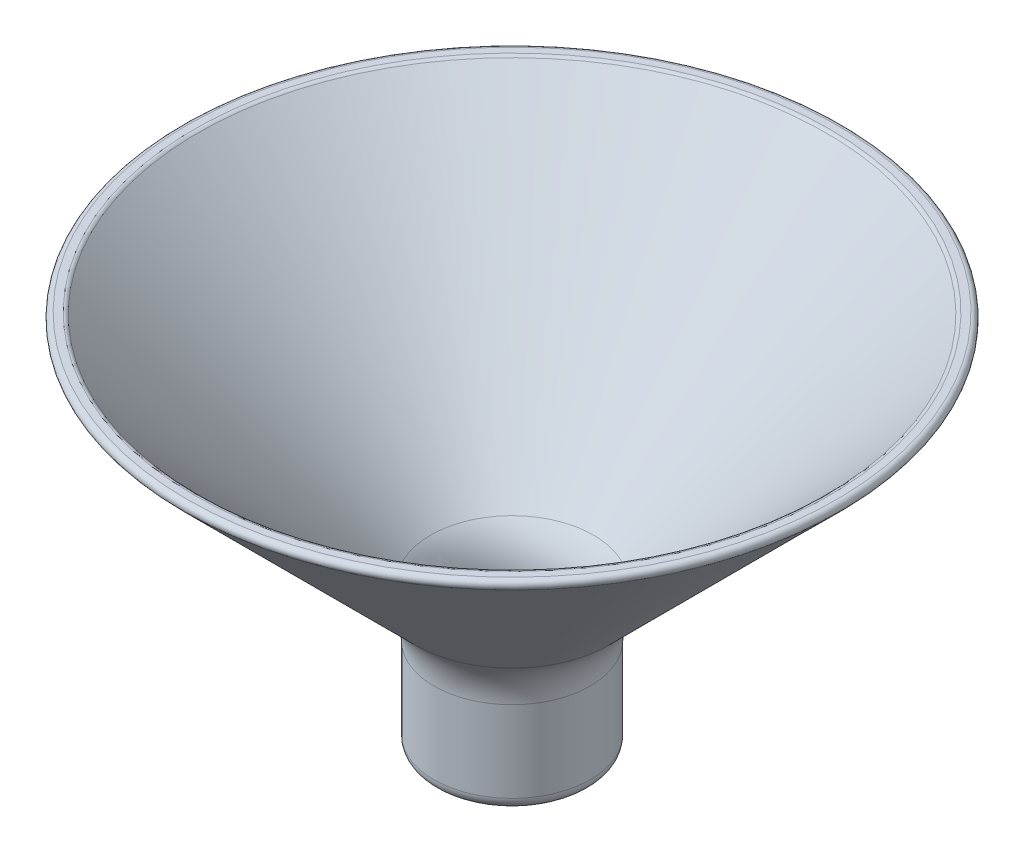
ISO-10303-21;
HEADER;
FILE_DESCRIPTION(('STEP AP214'),'2;1');
FILE_NAME('part.step','',(''),(''),'','','');
FILE_SCHEMA(('AUTOMOTIVE_DESIGN { 1 0 10303 214 1 1 1 1 }'));
ENDSEC;
DATA;
#1=APPLICATION_CONTEXT('core data for automotive mechanical design processes');
#2=APPLICATION_PROTOCOL_DEFINITION('international standard','automotive_design',2000,#1);
#3=PRODUCT_CONTEXT('',#1,'mechanical');
#4=PRODUCT('Part','Part','',(#3));
#5=PRODUCT_RELATED_PRODUCT_CATEGORY('part','',(#4));
#6=PRODUCT_DEFINITION_FORMATION('','',#4);
#7=PRODUCT_DEFINITION_CONTEXT('part definition',#1,'design');
#8=PRODUCT_DEFINITION('design','',#6,#7);
#9=PRODUCT_DEFINITION_SHAPE('','',#8);
#10=(LENGTH_UNIT() NAMED_UNIT(*) SI_UNIT(.MILLI.,.METRE.));
#11=(NAMED_UNIT(*) PLANE_ANGLE_UNIT() SI_UNIT($,.RADIAN.));
#12=(NAMED_UNIT(*) SI_UNIT($,.STERADIAN.) SOLID_ANGLE_UNIT());
#13=UNCERTAINTY_MEASURE_WITH_UNIT(LENGTH_MEASURE(1.E-05),#10,'distance_accuracy_value','');
#14=(GEOMETRIC_REPRESENTATION_CONTEXT(3) GLOBAL_UNCERTAINTY_ASSIGNED_CONTEXT((#13)) GLOBAL_UNIT_ASSIGNED_CONTEXT((#10,
#11,#12)) REPRESENTATION_CONTEXT('',''));
#15=CARTESIAN_POINT('',(0.,0.,0.));
#16=DIRECTION('',(0.,0.,1.));
#17=DIRECTION('',(1.,0.,0.));
#18=AXIS2_PLACEMENT_3D('',#15,#16,#17);
#19=CARTESIAN_POINT('',(2.,0.,0.));
#20=DIRECTION('',(0.,-1.,0.));
#21=DIRECTION('',(0.,0.,-1.));
#22=AXIS2_PLACEMENT_3D('',#19,#20,#21);
#23=PLANE('',#22);
#24=CARTESIAN_POINT('',(0.,0.,0.));
#25=DIRECTION('',(0.,-1.,0.));
#26=DIRECTION('',(0.,0.,-1.));
#27=AXIS2_PLACEMENT_3D('',#24,#25,#26);
#28=CIRCLE('',#27,5.2);
#29=CARTESIAN_POINT('',(0.,0.,-5.2));
#30=VERTEX_POINT('',#29);
#31=EDGE_CURVE('E38',#30,#30,#28,.T.);
#32=ORIENTED_EDGE('',*,*,#31,.T.);
#33=EDGE_LOOP('',(#32));
#34=FACE_BOUND('',#33,.T.);
#35=CARTESIAN_POINT('',(0.,0.,0.));
#36=DIRECTION('',(0.,-1.,0.));
#37=DIRECTION('',(0.,0.,-1.));
#38=AXIS2_PLACEMENT_3D('',#35,#36,#37);
#39=CIRCLE('',#38,2.);
#40=CARTESIAN_POINT('',(0.,0.,-2.));
#41=VERTEX_POINT('',#40);
#42=EDGE_CURVE('E69',#41,#41,#39,.T.);
#43=ORIENTED_EDGE('',*,*,#42,.F.);
#44=EDGE_LOOP('',(#43));
#45=FACE_BOUND('',#44,.T.);
#46=ADVANCED_FACE('F31',(#34,#45),#23,.T.);
#47=CARTESIAN_POINT('',(0.,5.19615242270666,0.));
#48=DIRECTION('',(0.,1.,0.));
#49=DIRECTION('',(0.,0.,1.));
#50=AXIS2_PLACEMENT_3D('',#47,#48,#49);
#51=CONICAL_SURFACE('',#50,5.,0.523598775598296);
#52=ORIENTED_EDGE('',*,*,#42,.T.);
#53=EDGE_LOOP('',(#52));
#54=FACE_BOUND('',#53,.T.);
#55=CARTESIAN_POINT('',(0.,5.19615242270666,0.));
#56=DIRECTION('',(0.,-1.,0.));
#57=DIRECTION('',(0.,0.,-1.));
#58=AXIS2_PLACEMENT_3D('',#55,#56,#57);
#59=CIRCLE('',#58,5.);
#60=CARTESIAN_POINT('',(0.,5.19615242270666,-5.));
#61=VERTEX_POINT('',#60);
#62=EDGE_CURVE('E72',#61,#61,#59,.T.);
#63=ORIENTED_EDGE('',*,*,#62,.F.);
#64=EDGE_LOOP('',(#63));
#65=FACE_BOUND('',#64,.T.);
#66=ADVANCED_FACE('F78',(#54,#65),#51,.F.);
#67=CARTESIAN_POINT('',(0.,0.,0.));
#68=DIRECTION('',(0.,-1.,0.));
#69=DIRECTION('',(0.,0.,-1.));
#70=AXIS2_PLACEMENT_3D('',#67,#68,#69);
#71=CYLINDRICAL_SURFACE('',#70,5.);
#72=CARTESIAN_POINT('',(0.,7.92893218813452,0.));
#73=DIRECTION('',(0.,1.,0.));
#74=DIRECTION('',(0.,0.,1.));
#75=AXIS2_PLACEMENT_3D('',#72,#73,#74);
#76=CIRCLE('',#75,5.);
#77=CARTESIAN_POINT('',(0.,7.92893218813452,5.));
#78=VERTEX_POINT('',#77);
#79=EDGE_CURVE('E63',#78,#78,#76,.T.);
#80=ORIENTED_EDGE('',*,*,#79,.T.);
#81=EDGE_LOOP('',(#80));
#82=FACE_BOUND('',#81,.T.);
#83=ORIENTED_EDGE('',*,*,#62,.T.);
#84=EDGE_LOOP('',(#83));
#85=FACE_BOUND('',#84,.T.);
#86=ADVANCED_FACE('F76',(#82,#85),#71,.F.);
#87=CARTESIAN_POINT('',(0.,30.,0.));
#88=DIRECTION('',(0.,1.,0.));
#89=DIRECTION('',(0.,0.,1.));
#90=AXIS2_PLACEMENT_3D('',#87,#88,#89);
#91=CONICAL_SURFACE('',#90,25.0000000000001,0.78539816339745);
#92=CARTESIAN_POINT('',(0.,29.8828427124746,0.));
#93=DIRECTION('',(0.,-1.,0.));
#94=DIRECTION('',(0.,0.,-1.));
#95=AXIS2_PLACEMENT_3D('',#92,#93,#94);
#96=CIRCLE('',#95,24.8828427124747);
#97=CARTESIAN_POINT('',(0.,29.8828427124746,24.8828427124747));
#98=VERTEX_POINT('',#97);
#99=EDGE_CURVE('E42',#98,#98,#96,.F.);
#100=CARTESIAN_POINT('',(0.,11.4644660940673,0.));
#101=DIRECTION('',(0.,-1.,0.));
#102=DIRECTION('',(0.,0.,-1.));
#103=AXIS2_PLACEMENT_3D('',#100,#101,#102);
#104=CIRCLE('',#103,6.46446609406727);
#105=CARTESIAN_POINT('',(0.,11.4644660940673,6.46446609406726));
#106=VERTEX_POINT('',#105);
#107=EDGE_CURVE('E66',#106,#106,#104,.T.);
#108=CARTESIAN_POINT('',(0.,29.8828427124746,24.8828427124747));
#109=CARTESIAN_POINT('',(0.,29.6909846226995,24.6909846226996));
#110=CARTESIAN_POINT('',(0.,29.4991265329245,24.4991265329245));
#111=CARTESIAN_POINT('',(0.,29.1154103533743,24.1154103533744));
#112=CARTESIAN_POINT('',(0.,28.9235522635992,23.9235522635993));
#113=CARTESIAN_POINT('',(0.,28.5398360840491,23.5398360840491));
#114=CARTESIAN_POINT('',(0.,28.347977994274,23.3479779942741));
#115=CARTESIAN_POINT('',(0.,27.9642618147239,22.9642618147239));
#116=CARTESIAN_POINT('',(0.,27.7724037249488,22.7724037249488));
#117=CARTESIAN_POINT('',(0.,27.3886875453986,22.3886875453987));
#118=CARTESIAN_POINT('',(0.,27.1968294556235,22.1968294556236));
#119=CARTESIAN_POINT('',(0.,26.8131132760734,21.8131132760734));
#120=CARTESIAN_POINT('',(0.,26.6212551862983,21.6212551862984));
#121=CARTESIAN_POINT('',(0.,26.2375390067482,21.2375390067482));
#122=CARTESIAN_POINT('',(0.,26.0456809169731,21.0456809169731));
#123=CARTESIAN_POINT('',(0.,25.6619647374229,20.661964737423));
#124=CARTESIAN_POINT('',(0.,25.4701066476479,20.4701066476479));
#125=CARTESIAN_POINT('',(0.,25.0863904680977,20.0863904680977));
#126=CARTESIAN_POINT('',(0.,24.8945323783226,19.8945323783227));
#127=CARTESIAN_POINT('',(0.,24.5108161987725,19.5108161987725));
#128=CARTESIAN_POINT('',(0.,24.3189581089974,19.3189581089974));
#129=CARTESIAN_POINT('',(0.,23.9352419294472,18.9352419294473));
#130=CARTESIAN_POINT('',(0.,23.7433838396722,18.7433838396722));
#131=CARTESIAN_POINT('',(0.,23.359667660122,18.3596676601221));
#132=CARTESIAN_POINT('',(0.,23.1678095703469,18.167809570347));
#133=CARTESIAN_POINT('',(0.,22.7840933907968,17.7840933907968));
#134=CARTESIAN_POINT('',(0.,22.5922353010217,17.5922353010217));
#135=CARTESIAN_POINT('',(0.,22.2085191214716,17.2085191214716));
#136=CARTESIAN_POINT('',(0.,22.0166610316965,17.0166610316965));
#137=CARTESIAN_POINT('',(0.,21.6329448521463,16.6329448521464));
#138=CARTESIAN_POINT('',(0.,21.4410867623712,16.4410867623713));
#139=CARTESIAN_POINT('',(0.,21.0573705828211,16.0573705828211));
#140=CARTESIAN_POINT('',(0.,20.865512493046,15.865512493046));
#141=CARTESIAN_POINT('',(0.,20.4817963134959,15.4817963134959));
#142=CARTESIAN_POINT('',(0.,20.2899382237208,15.2899382237208));
#143=CARTESIAN_POINT('',(0.,19.9062220441706,14.9062220441707));
#144=CARTESIAN_POINT('',(0.,19.7143639543956,14.7143639543956));
#145=CARTESIAN_POINT('',(0.,19.3306477748454,14.3306477748454));
#146=CARTESIAN_POINT('',(0.,19.1387896850703,14.1387896850704));
#147=CARTESIAN_POINT('',(0.,18.7550735055202,13.7550735055202));
#148=CARTESIAN_POINT('',(0.,18.5632154157451,13.5632154157451));
#149=CARTESIAN_POINT('',(0.,18.1794992361949,13.179499236195));
#150=CARTESIAN_POINT('',(0.,17.9876411464199,12.9876411464199));
#151=CARTESIAN_POINT('',(0.,17.6039249668697,12.6039249668697));
#152=CARTESIAN_POINT('',(0.,17.4120668770946,12.4120668770947));
#153=CARTESIAN_POINT('',(0.,17.0283506975445,12.0283506975445));
#154=CARTESIAN_POINT('',(0.,16.8364926077694,11.8364926077694));
#155=CARTESIAN_POINT('',(0.,16.4527764282193,11.4527764282193));
#156=CARTESIAN_POINT('',(0.,16.2609183384442,11.2609183384442));
#157=CARTESIAN_POINT('',(0.,15.877202158894,10.877202158894));
#158=CARTESIAN_POINT('',(0.,15.6853440691189,10.685344069119));
#159=CARTESIAN_POINT('',(0.,15.3016278895688,10.3016278895688));
#160=CARTESIAN_POINT('',(0.,15.1097697997937,10.1097697997937));
#161=CARTESIAN_POINT('',(0.,14.7260536202436,9.72605362024358));
#162=CARTESIAN_POINT('',(0.,14.5341955304685,9.5341955304685));
#163=CARTESIAN_POINT('',(0.,14.1504793509183,9.15047935091834));
#164=CARTESIAN_POINT('',(0.,13.9586212611433,8.95862126114326));
#165=CARTESIAN_POINT('',(0.,13.5749050815931,8.57490508159311));
#166=CARTESIAN_POINT('',(0.,13.383046991818,8.38304699181804));
#167=CARTESIAN_POINT('',(0.,12.9993308122679,7.99933081226789));
#168=CARTESIAN_POINT('',(0.,12.8074727224928,7.80747272249281));
#169=CARTESIAN_POINT('',(0.,12.4237565429426,7.42375654294265));
#170=CARTESIAN_POINT('',(0.,12.2318984531676,7.23189845316757));
#171=CARTESIAN_POINT('',(0.,11.8481822736174,6.84818227361742));
#172=CARTESIAN_POINT('',(0.,11.6563241838423,6.65632418384234));
#173=CARTESIAN_POINT('',(0.,11.4644660940673,6.46446609406726));
#174=B_SPLINE_CURVE_WITH_KNOTS('',3,(#108,#109,#110,#111,#112,#113,#114,#115,#116,#117,#118,
#119,#120,#121,#122,#123,#124,#125,#126,#127,#128,#129,#130,#131,#132,#133,#134,#135,#136,#137,
#138,#139,#140,#141,#142,#143,#144,#145,#146,#147,#148,#149,#150,#151,#152,#153,#154,#155,#156,
#157,#158,#159,#160,#161,#162,#163,#164,#165,#166,#167,#168,#169,#170,#171,#172,#173),
.UNSPECIFIED.,.F.,.F.,(4,2,2,2,2,2,2,2,2,2,2,2,2,2,2,2,2,2,2,2,2,2,2,2,2,2,2,2,2,2,2,2,4),(0.,
0.813984937832724,1.62796987566545,2.44195481349817,3.2559397513309,4.06992468916363,
4.88390962699635,5.69789456482908,6.5118795026618,7.32586444049453,8.13984937832726,
8.95383431615998,9.76781925399271,10.5818041918254,11.3957891296582,12.2097740674909,
13.0237590053236,13.8377439431563,14.6517288809891,15.4657138188218,16.2796987566545,
17.0936836944872,17.90766863232,18.7216535701527,19.5356385079854,20.3496234458181,
21.1636083836509,21.9775933214836,22.7915782593163,23.605563197149,24.4195481349818,
25.2335330728145,26.0475180106472),.UNSPECIFIED.);
#175=EDGE_CURVE('BSEAM86',#98,#106,#174,.T.);
#176=ORIENTED_EDGE('',*,*,#99,.T.);
#177=ORIENTED_EDGE('',*,*,#107,.T.);
#178=ORIENTED_EDGE('',*,*,#175,.T.);
#179=ORIENTED_EDGE('',*,*,#175,.F.);
#180=EDGE_LOOP('',(#176,#178,#177,#179));
#181=FACE_BOUND('',#180,.T.);
#182=ADVANCED_FACE('F86',(#181),#91,.F.);
#183=CARTESIAN_POINT('',(25.0000000000001,30.,0.));
#184=DIRECTION('',(0.,1.,0.));
#185=DIRECTION('',(0.,0.,1.));
#186=AXIS2_PLACEMENT_3D('',#183,#184,#185);
#187=PLANE('',#186);
#188=CARTESIAN_POINT('',(0.,30.,0.));
#189=DIRECTION('',(0.,1.,0.));
#190=DIRECTION('',(0.,0.,1.));
#191=AXIS2_PLACEMENT_3D('',#188,#189,#190);
#192=CIRCLE('',#191,25.7313708498985);
#193=CARTESIAN_POINT('',(0.,30.,25.7313708498985));
#194=VERTEX_POINT('',#193);
#195=EDGE_CURVE('E46',#194,#194,#192,.T.);
#196=ORIENTED_EDGE('',*,*,#195,.T.);
#197=EDGE_LOOP('',(#196));
#198=FACE_BOUND('',#197,.T.);
#199=CARTESIAN_POINT('',(0.,30.,0.));
#200=DIRECTION('',(0.,1.,0.));
#201=DIRECTION('',(0.,0.,1.));
#202=AXIS2_PLACEMENT_3D('',#199,#200,#201);
#203=CIRCLE('',#202,25.1656854249493);
#204=CARTESIAN_POINT('',(0.,30.,25.1656854249493));
#205=VERTEX_POINT('',#204);
#206=EDGE_CURVE('E51',#205,#205,#203,.F.);
#207=ORIENTED_EDGE('',*,*,#206,.T.);
#208=EDGE_LOOP('',(#207));
#209=FACE_BOUND('',#208,.T.);
#210=ADVANCED_FACE('F116',(#198,#209),#187,.T.);
#211=CARTESIAN_POINT('',(0.,9.50294372515229,0.));
#212=DIRECTION('',(0.,1.,0.));
#213=DIRECTION('',(0.,0.,1.));
#214=AXIS2_PLACEMENT_3D('',#211,#212,#213);
#215=CONICAL_SURFACE('',#214,6.2,0.78539816339745);
#216=CARTESIAN_POINT('',(0.,29.3171572875254,0.));
#217=DIRECTION('',(0.,-1.,0.));
#218=DIRECTION('',(0.,0.,-1.));
#219=AXIS2_PLACEMENT_3D('',#216,#217,#218);
#220=CIRCLE('',#219,26.0142135623732);
#221=CARTESIAN_POINT('',(0.,29.3171572875254,26.0142135623732));
#222=VERTEX_POINT('',#221);
#223=EDGE_CURVE('E54',#222,#222,#220,.T.);
#224=CARTESIAN_POINT('',(0.,10.9674098192195,0.));
#225=DIRECTION('',(0.,1.,0.));
#226=DIRECTION('',(0.,0.,1.));
#227=AXIS2_PLACEMENT_3D('',#224,#225,#226);
#228=CIRCLE('',#227,7.66446609406727);
#229=CARTESIAN_POINT('',(0.,10.9674098192195,7.66446609406727));
#230=VERTEX_POINT('',#229);
#231=EDGE_CURVE('E57',#230,#230,#228,.T.);
#232=CARTESIAN_POINT('',(0.,29.3171572875254,26.0142135623732));
#233=CARTESIAN_POINT('',(0.,29.1260140847305,25.8230703595783));
#234=CARTESIAN_POINT('',(0.,28.9348708819357,25.6319271567835));
#235=CARTESIAN_POINT('',(0.,28.552584476346,25.2496407511938));
#236=CARTESIAN_POINT('',(0.,28.3614412735511,25.0584975483989));
#237=CARTESIAN_POINT('',(0.,27.9791548679614,24.6762111428092));
#238=CARTESIAN_POINT('',(0.,27.7880116651666,24.4850679400143));
#239=CARTESIAN_POINT('',(0.,27.4057252595769,24.1027815344246));
#240=CARTESIAN_POINT('',(0.,27.214582056782,23.9116383316298));
#241=CARTESIAN_POINT('',(0.,26.8322956511923,23.5293519260401));
#242=CARTESIAN_POINT('',(0.,26.6411524483974,23.3382087232452));
#243=CARTESIAN_POINT('',(0.,26.2588660428077,22.9559223176555));
#244=CARTESIAN_POINT('',(0.,26.0677228400129,22.7647791148607));
#245=CARTESIAN_POINT('',(0.,25.6854364344232,22.382492709271));
#246=CARTESIAN_POINT('',(0.,25.4942932316283,22.1913495064761));
#247=CARTESIAN_POINT('',(0.,25.1120068260386,21.8090631008864));
#248=CARTESIAN_POINT('',(0.,24.9208636232438,21.6179198980915));
#249=CARTESIAN_POINT('',(0.,24.5385772176541,21.2356334925018));
#250=CARTESIAN_POINT('',(0.,24.3474340148592,21.044490289707));
#251=CARTESIAN_POINT('',(0.,23.9651476092695,20.6622038841173));
#252=CARTESIAN_POINT('',(0.,23.7740044064747,20.4710606813224));
#253=CARTESIAN_POINT('',(0.,23.391718000885,20.0887742757327));
#254=CARTESIAN_POINT('',(0.,23.2005747980901,19.8976310729379));
#255=CARTESIAN_POINT('',(0.,22.8182883925004,19.5153446673482));
#256=CARTESIAN_POINT('',(0.,22.6271451897055,19.3242014645533));
#257=CARTESIAN_POINT('',(0.,22.2448587841158,18.9419150589636));
#258=CARTESIAN_POINT('',(0.,22.053715581321,18.7507718561687));
#259=CARTESIAN_POINT('',(0.,21.6714291757313,18.368485450579));
#260=CARTESIAN_POINT('',(0.,21.4802859729364,18.1773422477842));
#261=CARTESIAN_POINT('',(0.,21.0979995673467,17.7950558421945));
#262=CARTESIAN_POINT('',(0.,20.9068563645519,17.6039126393996));
#263=CARTESIAN_POINT('',(0.,20.5245699589622,17.2216262338099));
#264=CARTESIAN_POINT('',(0.,20.3334267561673,17.0304830310151));
#265=CARTESIAN_POINT('',(0.,19.9511403505776,16.6481966254254));
#266=CARTESIAN_POINT('',(0.,19.7599971477828,16.4570534226305));
#267=CARTESIAN_POINT('',(0.,19.3777107421931,16.0747670170408));
#268=CARTESIAN_POINT('',(0.,19.1865675393982,15.883623814246));
#269=CARTESIAN_POINT('',(0.,18.8042811338085,15.5013374086562));
#270=CARTESIAN_POINT('',(0.,18.6131379310136,15.3101942058614));
#271=CARTESIAN_POINT('',(0.,18.2308515254239,14.9279078002717));
#272=CARTESIAN_POINT('',(0.,18.0397083226291,14.7367645974768));
#273=CARTESIAN_POINT('',(0.,17.6574219170394,14.3544781918871));
#274=CARTESIAN_POINT('',(0.,17.4662787142445,14.1633349890923));
#275=CARTESIAN_POINT('',(0.,17.0839923086548,13.7810485835026));
#276=CARTESIAN_POINT('',(0.,16.89284910586,13.5899053807077));
#277=CARTESIAN_POINT('',(0.,16.5105627002703,13.207618975118));
#278=CARTESIAN_POINT('',(0.,16.3194194974754,13.0164757723232));
#279=CARTESIAN_POINT('',(0.,15.9371330918857,12.6341893667334));
#280=CARTESIAN_POINT('',(0.,15.7459898890909,12.4430461639386));
#281=CARTESIAN_POINT('',(0.,15.3637034835012,12.0607597583489));
#282=CARTESIAN_POINT('',(0.,15.1725602807063,11.869616555554));
#283=CARTESIAN_POINT('',(0.,14.7902738751166,11.4873301499643));
#284=CARTESIAN_POINT('',(0.,14.5991306723217,11.2961869471695));
#285=CARTESIAN_POINT('',(0.,14.216844266732,10.9139005415798));
#286=CARTESIAN_POINT('',(0.,14.0257010639372,10.7227573387849));
#287=CARTESIAN_POINT('',(0.,13.6434146583475,10.3404709331952));
#288=CARTESIAN_POINT('',(0.,13.4522714555526,10.1493277304004));
#289=CARTESIAN_POINT('',(0.,13.0699850499629,9.76704132481065));
#290=CARTESIAN_POINT('',(0.,12.8788418471681,9.5758981220158));
#291=CARTESIAN_POINT('',(0.,12.4965554415784,9.19361171642609));
#292=CARTESIAN_POINT('',(0.,12.3054122387835,9.00246851363124));
#293=CARTESIAN_POINT('',(0.,11.9231258331938,8.62018210804153));
#294=CARTESIAN_POINT('',(0.,11.731982630399,8.42903890524668));
#295=CARTESIAN_POINT('',(0.,11.3496962248093,8.04675249965698));
#296=CARTESIAN_POINT('',(0.,11.1585530220144,7.85560929686212));
#297=CARTESIAN_POINT('',(0.,10.9674098192195,7.66446609406727));
#298=B_SPLINE_CURVE_WITH_KNOTS('',3,(#232,#233,#234,#235,#236,#237,#238,#239,#240,#241,#242,
#243,#244,#245,#246,#247,#248,#249,#250,#251,#252,#253,#254,#255,#256,#257,#258,#259,#260,#261,
#262,#263,#264,#265,#266,#267,#268,#269,#270,#271,#272,#273,#274,#275,#276,#277,#278,#279,#280,
#281,#282,#283,#284,#285,#286,#287,#288,#289,#290,#291,#292,#293,#294,#295,#296,#297),
.UNSPECIFIED.,.F.,.F.,(4,2,2,2,2,2,2,2,2,2,2,2,2,2,2,2,2,2,2,2,2,2,2,2,2,2,2,2,2,2,2,2,4),(0.,
0.810951929243735,1.62190385848747,2.4328557877312,3.24380771697494,4.05475964621868,
4.86571157546241,5.67666350470615,6.48761543394988,7.29856736319362,8.10951929243735,
8.92047122168109,9.73142315092482,10.5423750801686,11.3533270094123,12.164278938656,
12.9752308678998,13.7861827971435,14.5971347263872,15.408086655631,16.2190385848747,
17.0299905141184,17.8409424433622,18.6518943726059,19.4628463018496,20.2737982310934,
21.0847501603371,21.8957020895808,22.7066540188246,23.5176059480683,24.3285578773121,
25.1395098065558,25.9504617357995),.UNSPECIFIED.);
#299=EDGE_CURVE('BSEAM118',#222,#230,#298,.T.);
#300=ORIENTED_EDGE('',*,*,#223,.T.);
#301=ORIENTED_EDGE('',*,*,#231,.T.);
#302=ORIENTED_EDGE('',*,*,#299,.T.);
#303=ORIENTED_EDGE('',*,*,#299,.F.);
#304=EDGE_LOOP('',(#300,#302,#301,#303));
#305=FACE_BOUND('',#304,.T.);
#306=ADVANCED_FACE('F118',(#305),#215,.T.);
#307=CARTESIAN_POINT('',(0.,0.,0.));
#308=DIRECTION('',(0.,-1.,0.));
#309=DIRECTION('',(0.,0.,-1.));
#310=AXIS2_PLACEMENT_3D('',#307,#308,#309);
#311=CYLINDRICAL_SURFACE('',#310,6.2);
#312=CARTESIAN_POINT('',(0.,1.,0.));
#313=DIRECTION('',(0.,-1.,0.));
#314=DIRECTION('',(0.,0.,-1.));
#315=AXIS2_PLACEMENT_3D('',#312,#313,#314);
#316=CIRCLE('',#315,6.2);
#317=CARTESIAN_POINT('',(0.,1.,-6.2));
#318=VERTEX_POINT('',#317);
#319=EDGE_CURVE('E10',#318,#318,#316,.F.);
#320=ORIENTED_EDGE('',*,*,#319,.T.);
#321=EDGE_LOOP('',(#320));
#322=FACE_BOUND('',#321,.T.);
#323=CARTESIAN_POINT('',(0.,7.43187591328681,0.));
#324=DIRECTION('',(0.,-1.,0.));
#325=DIRECTION('',(0.,0.,-1.));
#326=AXIS2_PLACEMENT_3D('',#323,#324,#325);
#327=CIRCLE('',#326,6.2);
#328=CARTESIAN_POINT('',(0.,7.43187591328681,-6.2));
#329=VERTEX_POINT('',#328);
#330=EDGE_CURVE('E60',#329,#329,#327,.T.);
#331=ORIENTED_EDGE('',*,*,#330,.T.);
#332=EDGE_LOOP('',(#331));
#333=FACE_BOUND('',#332,.T.);
#334=ADVANCED_FACE('F97',(#322,#333),#311,.T.);
#335=CARTESIAN_POINT('',(0.,7.92893218813452,0.));
#336=DIRECTION('',(0.,1.,0.));
#337=DIRECTION('',(0.,0.,1.));
#338=AXIS2_PLACEMENT_3D('',#335,#336,#337);
#339=TOROIDAL_SURFACE('',#338,10.,5.);
#340=ORIENTED_EDGE('',*,*,#79,.F.);
#341=EDGE_LOOP('',(#340));
#342=FACE_BOUND('',#341,.T.);
#343=ORIENTED_EDGE('',*,*,#107,.F.);
#344=EDGE_LOOP('',(#343));
#345=FACE_BOUND('',#344,.T.);
#346=ADVANCED_FACE('F93',(#342,#345),#339,.T.);
#347=CARTESIAN_POINT('',(0.,7.43187591328681,0.));
#348=DIRECTION('',(0.,-1.,0.));
#349=DIRECTION('',(0.,0.,-1.));
#350=AXIS2_PLACEMENT_3D('',#347,#348,#349);
#351=TOROIDAL_SURFACE('',#350,11.2,5.);
#352=ORIENTED_EDGE('',*,*,#231,.F.);
#353=EDGE_LOOP('',(#352));
#354=FACE_BOUND('',#353,.T.);
#355=ORIENTED_EDGE('',*,*,#330,.F.);
#356=EDGE_LOOP('',(#355));
#357=FACE_BOUND('',#356,.T.);
#358=ADVANCED_FACE('F96',(#354,#357),#351,.F.);
#359=CARTESIAN_POINT('',(0.,29.6,0.));
#360=DIRECTION('',(0.,1.,0.));
#361=DIRECTION('',(0.,0.,1.));
#362=AXIS2_PLACEMENT_3D('',#359,#360,#361);
#363=TOROIDAL_SURFACE('',#362,25.7313708498985,0.4);
#364=ORIENTED_EDGE('',*,*,#195,.F.);
#365=EDGE_LOOP('',(#364));
#366=FACE_BOUND('',#365,.T.);
#367=ORIENTED_EDGE('',*,*,#223,.F.);
#368=EDGE_LOOP('',(#367));
#369=FACE_BOUND('',#368,.T.);
#370=ADVANCED_FACE('F101',(#366,#369),#363,.T.);
#371=CARTESIAN_POINT('',(0.,29.6,0.));
#372=DIRECTION('',(0.,1.,0.));
#373=DIRECTION('',(0.,0.,1.));
#374=AXIS2_PLACEMENT_3D('',#371,#372,#373);
#375=TOROIDAL_SURFACE('',#374,25.1656854249493,0.4);
#376=ORIENTED_EDGE('',*,*,#99,.F.);
#377=EDGE_LOOP('',(#376));
#378=FACE_BOUND('',#377,.T.);
#379=ORIENTED_EDGE('',*,*,#206,.F.);
#380=EDGE_LOOP('',(#379));
#381=FACE_BOUND('',#380,.T.);
#382=ADVANCED_FACE('F104',(#378,#381),#375,.T.);
#383=CARTESIAN_POINT('',(0.,1.,0.));
#384=DIRECTION('',(0.,-1.,0.));
#385=DIRECTION('',(0.,0.,-1.));
#386=AXIS2_PLACEMENT_3D('',#383,#384,#385);
#387=TOROIDAL_SURFACE('',#386,5.2,1.);
#388=ORIENTED_EDGE('',*,*,#319,.F.);
#389=EDGE_LOOP('',(#388));
#390=FACE_BOUND('',#389,.T.);
#391=ORIENTED_EDGE('',*,*,#31,.F.);
#392=EDGE_LOOP('',(#391));
#393=FACE_BOUND('',#392,.T.);
#394=ADVANCED_FACE('F33',(#390,#393),#387,.T.);
#395=CLOSED_SHELL('',(#46,#66,#86,#182,#210,#306,#334,#346,#358,#370,#382,#394));
#396=MANIFOLD_SOLID_BREP('B2',#395);
#397=ADVANCED_BREP_SHAPE_REPRESENTATION('',(#18,#396),#14);
#398=SHAPE_DEFINITION_REPRESENTATION(#9,#397);
ENDSEC;
END-ISO-10303-21;
